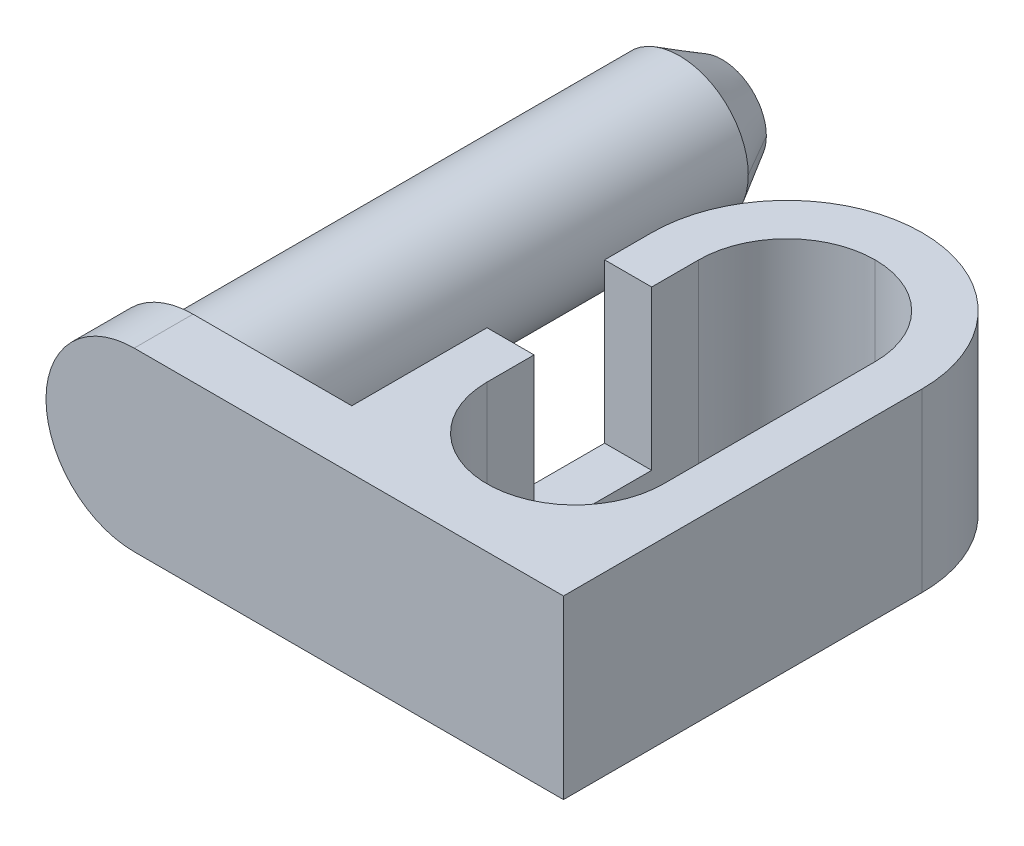
ISO-10303-21;
HEADER;
FILE_DESCRIPTION(('STEP AP214'),'2;1');
FILE_NAME('part.step','',(''),(''),'','','');
FILE_SCHEMA(('AUTOMOTIVE_DESIGN { 1 0 10303 214 1 1 1 1 }'));
ENDSEC;
DATA;
#1=APPLICATION_CONTEXT('core data for automotive mechanical design processes');
#2=APPLICATION_PROTOCOL_DEFINITION('international standard','automotive_design',2000,#1);
#3=PRODUCT_CONTEXT('',#1,'mechanical');
#4=PRODUCT('Part','Part','',(#3));
#5=PRODUCT_RELATED_PRODUCT_CATEGORY('part','',(#4));
#6=PRODUCT_DEFINITION_FORMATION('','',#4);
#7=PRODUCT_DEFINITION_CONTEXT('part definition',#1,'design');
#8=PRODUCT_DEFINITION('design','',#6,#7);
#9=PRODUCT_DEFINITION_SHAPE('','',#8);
#10=(LENGTH_UNIT() NAMED_UNIT(*) SI_UNIT(.MILLI.,.METRE.));
#11=(NAMED_UNIT(*) PLANE_ANGLE_UNIT() SI_UNIT($,.RADIAN.));
#12=(NAMED_UNIT(*) SI_UNIT($,.STERADIAN.) SOLID_ANGLE_UNIT());
#13=UNCERTAINTY_MEASURE_WITH_UNIT(LENGTH_MEASURE(1.E-05),#10,'distance_accuracy_value','');
#14=(GEOMETRIC_REPRESENTATION_CONTEXT(3) GLOBAL_UNCERTAINTY_ASSIGNED_CONTEXT((#13)) GLOBAL_UNIT_ASSIGNED_CONTEXT((#10,
#11,#12)) REPRESENTATION_CONTEXT('',''));
#15=CARTESIAN_POINT('',(0.,0.,0.));
#16=DIRECTION('',(0.,0.,1.));
#17=DIRECTION('',(1.,0.,0.));
#18=AXIS2_PLACEMENT_3D('',#15,#16,#17);
#19=CARTESIAN_POINT('',(0.,-12.,0.));
#20=DIRECTION('',(0.,1.,0.));
#21=DIRECTION('',(1.,0.,0.));
#22=AXIS2_PLACEMENT_3D('',#19,#20,#21);
#23=PLANE('',#22);
#24=DIRECTION('',(0.,0.,1.));
#25=VECTOR('',#24,1.);
#26=CARTESIAN_POINT('',(27.,-12.,75.));
#27=LINE('',#26,#25);
#28=CARTESIAN_POINT('',(27.,-12.,47.));
#29=VERTEX_POINT('',#28);
#30=CARTESIAN_POINT('',(27.,-12.,67.));
#31=VERTEX_POINT('',#30);
#32=EDGE_CURVE('E283',#29,#31,#27,.T.);
#33=ORIENTED_EDGE('',*,*,#32,.T.);
#34=DIRECTION('',(1.,0.,0.));
#35=VECTOR('',#34,1.);
#36=CARTESIAN_POINT('',(25.,-12.,67.));
#37=LINE('',#36,#35);
#38=CARTESIAN_POINT('',(35.,-12.,67.));
#39=VERTEX_POINT('',#38);
#40=EDGE_CURVE('E328',#31,#39,#37,.T.);
#41=ORIENTED_EDGE('',*,*,#40,.T.);
#42=DIRECTION('',(0.,0.,1.));
#43=VECTOR('',#42,1.);
#44=CARTESIAN_POINT('',(35.,-12.,75.));
#45=LINE('',#44,#43);
#46=CARTESIAN_POINT('',(35.,-12.,47.));
#47=VERTEX_POINT('',#46);
#48=EDGE_CURVE('E331',#47,#39,#45,.T.);
#49=ORIENTED_EDGE('',*,*,#48,.F.);
#50=DIRECTION('',(-1.,0.,0.));
#51=VECTOR('',#50,1.);
#52=CARTESIAN_POINT('',(25.,-12.,47.));
#53=LINE('',#52,#51);
#54=EDGE_CURVE('E53',#47,#29,#53,.T.);
#55=ORIENTED_EDGE('',*,*,#54,.T.);
#56=EDGE_LOOP('',(#33,#41,#49,#55));
#57=FACE_BOUND('',#56,.T.);
#58=ADVANCED_FACE('F45',(#57),#23,.T.);
#59=CARTESIAN_POINT('',(25.,-12.,47.));
#60=DIRECTION('',(0.,0.,-1.));
#61=DIRECTION('',(0.,-1.,0.));
#62=AXIS2_PLACEMENT_3D('',#59,#60,#61);
#63=PLANE('',#62);
#64=ORIENTED_EDGE('',*,*,#54,.F.);
#65=DIRECTION('',(0.,1.,0.));
#66=VECTOR('',#65,1.);
#67=CARTESIAN_POINT('',(35.,7.,47.));
#68=LINE('',#67,#66);
#69=CARTESIAN_POINT('',(35.,15.,47.));
#70=VERTEX_POINT('',#69);
#71=EDGE_CURVE('E364',#47,#70,#68,.T.);
#72=ORIENTED_EDGE('',*,*,#71,.T.);
#73=DIRECTION('',(-1.,0.,0.));
#74=VECTOR('',#73,1.);
#75=CARTESIAN_POINT('',(25.,15.,47.));
#76=LINE('',#75,#74);
#77=CARTESIAN_POINT('',(27.,15.,47.));
#78=VERTEX_POINT('',#77);
#79=EDGE_CURVE('E352',#70,#78,#76,.T.);
#80=ORIENTED_EDGE('',*,*,#79,.T.);
#81=DIRECTION('',(0.,1.,0.));
#82=VECTOR('',#81,1.);
#83=CARTESIAN_POINT('',(27.,7.,47.));
#84=LINE('',#83,#82);
#85=EDGE_CURVE('E465',#29,#78,#84,.T.);
#86=ORIENTED_EDGE('',*,*,#85,.F.);
#87=EDGE_LOOP('',(#64,#72,#80,#86));
#88=FACE_BOUND('',#87,.T.);
#89=ADVANCED_FACE('F516',(#88),#63,.F.);
#90=CARTESIAN_POINT('',(25.,-12.,67.));
#91=DIRECTION('',(0.,0.,1.));
#92=DIRECTION('',(1.,0.,0.));
#93=AXIS2_PLACEMENT_3D('',#90,#91,#92);
#94=PLANE('',#93);
#95=DIRECTION('',(1.,0.,0.));
#96=VECTOR('',#95,1.);
#97=CARTESIAN_POINT('',(25.,15.,67.));
#98=LINE('',#97,#96);
#99=CARTESIAN_POINT('',(27.,15.,67.));
#100=VERTEX_POINT('',#99);
#101=CARTESIAN_POINT('',(35.,15.,67.));
#102=VERTEX_POINT('',#101);
#103=EDGE_CURVE('E355',#100,#102,#98,.T.);
#104=ORIENTED_EDGE('',*,*,#103,.T.);
#105=DIRECTION('',(0.,-1.,0.));
#106=VECTOR('',#105,1.);
#107=CARTESIAN_POINT('',(35.,7.,67.));
#108=LINE('',#107,#106);
#109=EDGE_CURVE('E344',#102,#39,#108,.T.);
#110=ORIENTED_EDGE('',*,*,#109,.T.);
#111=ORIENTED_EDGE('',*,*,#40,.F.);
#112=DIRECTION('',(0.,-1.,0.));
#113=VECTOR('',#112,1.);
#114=CARTESIAN_POINT('',(27.,7.,67.));
#115=LINE('',#114,#113);
#116=EDGE_CURVE('E279',#100,#31,#115,.T.);
#117=ORIENTED_EDGE('',*,*,#116,.F.);
#118=EDGE_LOOP('',(#104,#110,#111,#117));
#119=FACE_BOUND('',#118,.T.);
#120=ADVANCED_FACE('F522',(#119),#94,.F.);
#121=CARTESIAN_POINT('',(35.,7.,75.));
#122=DIRECTION('',(1.,0.,0.));
#123=DIRECTION('',(0.,0.,-1.));
#124=AXIS2_PLACEMENT_3D('',#121,#122,#123);
#125=PLANE('',#124);
#126=ORIENTED_EDGE('',*,*,#109,.F.);
#127=DIRECTION('',(0.,0.,1.));
#128=VECTOR('',#127,1.);
#129=CARTESIAN_POINT('',(35.,15.,75.));
#130=LINE('',#129,#128);
#131=CARTESIAN_POINT('',(35.,15.,75.));
#132=VERTEX_POINT('',#131);
#133=EDGE_CURVE('E334',#102,#132,#130,.T.);
#134=ORIENTED_EDGE('',*,*,#133,.T.);
#135=DIRECTION('',(0.,-1.,0.));
#136=VECTOR('',#135,1.);
#137=CARTESIAN_POINT('',(35.,7.,75.));
#138=LINE('',#137,#136);
#139=CARTESIAN_POINT('',(35.,-15.,75.));
#140=VERTEX_POINT('',#139);
#141=EDGE_CURVE('E365',#132,#140,#138,.T.);
#142=ORIENTED_EDGE('',*,*,#141,.T.);
#143=DIRECTION('',(0.,0.,1.));
#144=VECTOR('',#143,1.);
#145=CARTESIAN_POINT('',(35.,-15.,75.));
#146=LINE('',#145,#144);
#147=CARTESIAN_POINT('',(35.,-15.,39.));
#148=VERTEX_POINT('',#147);
#149=EDGE_CURVE('E314',#148,#140,#146,.T.);
#150=ORIENTED_EDGE('',*,*,#149,.F.);
#151=DIRECTION('',(0.,-1.,0.));
#152=VECTOR('',#151,1.);
#153=CARTESIAN_POINT('',(35.,7.,39.));
#154=LINE('',#153,#152);
#155=CARTESIAN_POINT('',(35.,15.,39.));
#156=VERTEX_POINT('',#155);
#157=EDGE_CURVE('E341',#156,#148,#154,.T.);
#158=ORIENTED_EDGE('',*,*,#157,.F.);
#159=DIRECTION('',(0.,0.,1.));
#160=VECTOR('',#159,1.);
#161=CARTESIAN_POINT('',(35.,15.,75.));
#162=LINE('',#161,#160);
#163=EDGE_CURVE('E274',#156,#70,#162,.T.);
#164=ORIENTED_EDGE('',*,*,#163,.T.);
#165=ORIENTED_EDGE('',*,*,#71,.F.);
#166=ORIENTED_EDGE('',*,*,#48,.T.);
#167=EDGE_LOOP('',(#126,#134,#142,#150,#158,#164,#165,#166));
#168=FACE_BOUND('',#167,.T.);
#169=ADVANCED_FACE('F449',(#168),#125,.T.);
#170=CARTESIAN_POINT('',(50.,7.,39.));
#171=DIRECTION('',(0.,-1.,0.));
#172=DIRECTION('',(0.,0.,-1.));
#173=AXIS2_PLACEMENT_3D('',#170,#171,#172);
#174=CYLINDRICAL_SURFACE('',#173,15.);
#175=DIRECTION('',(0.,-1.,0.));
#176=VECTOR('',#175,1.);
#177=CARTESIAN_POINT('',(50.,7.,24.));
#178=LINE('',#177,#176);
#179=CARTESIAN_POINT('',(50.,15.,24.));
#180=VERTEX_POINT('',#179);
#181=CARTESIAN_POINT('',(50.,-15.,24.));
#182=VERTEX_POINT('',#181);
#183=EDGE_CURVE('E304',#180,#182,#178,.T.);
#184=ORIENTED_EDGE('',*,*,#183,.F.);
#185=CARTESIAN_POINT('',(50.,15.,39.));
#186=DIRECTION('',(0.,1.,0.));
#187=DIRECTION('',(0.,0.,1.));
#188=AXIS2_PLACEMENT_3D('',#185,#186,#187);
#189=CIRCLE('',#188,15.);
#190=EDGE_CURVE('E270',#180,#156,#189,.T.);
#191=ORIENTED_EDGE('',*,*,#190,.T.);
#192=ORIENTED_EDGE('',*,*,#157,.T.);
#193=CARTESIAN_POINT('',(50.,-15.,39.));
#194=DIRECTION('',(0.,1.,0.));
#195=DIRECTION('',(0.,0.,1.));
#196=AXIS2_PLACEMENT_3D('',#193,#194,#195);
#197=CIRCLE('',#196,15.);
#198=EDGE_CURVE('E288',#182,#148,#197,.T.);
#199=ORIENTED_EDGE('',*,*,#198,.F.);
#200=EDGE_LOOP('',(#184,#191,#192,#199));
#201=FACE_BOUND('',#200,.T.);
#202=ADVANCED_FACE('F446',(#201),#174,.F.);
#203=CARTESIAN_POINT('',(65.,7.,75.));
#204=DIRECTION('',(-1.,0.,0.));
#205=DIRECTION('',(0.,0.,1.));
#206=AXIS2_PLACEMENT_3D('',#203,#204,#205);
#207=PLANE('',#206);
#208=DIRECTION('',(0.,0.,-1.));
#209=VECTOR('',#208,1.);
#210=CARTESIAN_POINT('',(65.,-15.,75.));
#211=LINE('',#210,#209);
#212=CARTESIAN_POINT('',(65.,-15.,75.));
#213=VERTEX_POINT('',#212);
#214=CARTESIAN_POINT('',(65.,-15.,39.));
#215=VERTEX_POINT('',#214);
#216=EDGE_CURVE('E284',#213,#215,#211,.T.);
#217=ORIENTED_EDGE('',*,*,#216,.F.);
#218=DIRECTION('',(0.,-1.,0.));
#219=VECTOR('',#218,1.);
#220=CARTESIAN_POINT('',(65.,7.,75.));
#221=LINE('',#220,#219);
#222=CARTESIAN_POINT('',(65.,15.,75.));
#223=VERTEX_POINT('',#222);
#224=EDGE_CURVE('E345',#223,#213,#221,.T.);
#225=ORIENTED_EDGE('',*,*,#224,.F.);
#226=DIRECTION('',(0.,0.,-1.));
#227=VECTOR('',#226,1.);
#228=CARTESIAN_POINT('',(65.,15.,75.));
#229=LINE('',#228,#227);
#230=CARTESIAN_POINT('',(65.,15.,39.));
#231=VERTEX_POINT('',#230);
#232=EDGE_CURVE('E267',#223,#231,#229,.T.);
#233=ORIENTED_EDGE('',*,*,#232,.T.);
#234=DIRECTION('',(0.,-1.,0.));
#235=VECTOR('',#234,1.);
#236=CARTESIAN_POINT('',(65.,7.,39.));
#237=LINE('',#236,#235);
#238=EDGE_CURVE('E310',#231,#215,#237,.T.);
#239=ORIENTED_EDGE('',*,*,#238,.T.);
#240=EDGE_LOOP('',(#217,#225,#233,#239));
#241=FACE_BOUND('',#240,.T.);
#242=ADVANCED_FACE('F527',(#241),#207,.T.);
#243=CARTESIAN_POINT('',(50.,7.,75.));
#244=DIRECTION('',(0.,-1.,0.));
#245=DIRECTION('',(0.,0.,-1.));
#246=AXIS2_PLACEMENT_3D('',#243,#244,#245);
#247=CYLINDRICAL_SURFACE('',#246,15.);
#248=CARTESIAN_POINT('',(50.,-15.,75.));
#249=DIRECTION('',(0.,1.,0.));
#250=DIRECTION('',(0.,0.,1.));
#251=AXIS2_PLACEMENT_3D('',#248,#249,#250);
#252=CIRCLE('',#251,15.);
#253=EDGE_CURVE('E289',#140,#213,#252,.T.);
#254=ORIENTED_EDGE('',*,*,#253,.F.);
#255=ORIENTED_EDGE('',*,*,#141,.F.);
#256=CARTESIAN_POINT('',(50.,15.,75.));
#257=DIRECTION('',(0.,1.,0.));
#258=DIRECTION('',(0.,0.,1.));
#259=AXIS2_PLACEMENT_3D('',#256,#257,#258);
#260=CIRCLE('',#259,15.);
#261=EDGE_CURVE('E269',#132,#223,#260,.T.);
#262=ORIENTED_EDGE('',*,*,#261,.T.);
#263=ORIENTED_EDGE('',*,*,#224,.T.);
#264=EDGE_LOOP('',(#254,#255,#262,#263));
#265=FACE_BOUND('',#264,.T.);
#266=ADVANCED_FACE('F532',(#265),#247,.F.);
#267=CARTESIAN_POINT('',(50.,7.,39.));
#268=DIRECTION('',(0.,-1.,0.));
#269=DIRECTION('',(0.,0.,-1.));
#270=AXIS2_PLACEMENT_3D('',#267,#268,#269);
#271=CYLINDRICAL_SURFACE('',#270,23.);
#272=DIRECTION('',(0.,-1.,0.));
#273=VECTOR('',#272,1.);
#274=CARTESIAN_POINT('',(50.,7.,16.));
#275=LINE('',#274,#273);
#276=CARTESIAN_POINT('',(50.,15.,16.));
#277=VERTEX_POINT('',#276);
#278=CARTESIAN_POINT('',(50.,-15.,16.));
#279=VERTEX_POINT('',#278);
#280=EDGE_CURVE('E278',#277,#279,#275,.T.);
#281=ORIENTED_EDGE('',*,*,#280,.F.);
#282=CARTESIAN_POINT('',(50.,15.,39.));
#283=DIRECTION('',(0.,1.,0.));
#284=DIRECTION('',(0.,0.,1.));
#285=AXIS2_PLACEMENT_3D('',#282,#283,#284);
#286=CIRCLE('',#285,23.);
#287=CARTESIAN_POINT('',(73.,15.,39.));
#288=VERTEX_POINT('',#287);
#289=EDGE_CURVE('E294',#288,#277,#286,.T.);
#290=ORIENTED_EDGE('',*,*,#289,.F.);
#291=DIRECTION('',(0.,-1.,0.));
#292=VECTOR('',#291,1.);
#293=CARTESIAN_POINT('',(73.,7.,39.));
#294=LINE('',#293,#292);
#295=CARTESIAN_POINT('',(73.,-15.,39.));
#296=VERTEX_POINT('',#295);
#297=EDGE_CURVE('E265',#288,#296,#294,.T.);
#298=ORIENTED_EDGE('',*,*,#297,.T.);
#299=CARTESIAN_POINT('',(50.,-15.,39.));
#300=DIRECTION('',(0.,1.,0.));
#301=DIRECTION('',(0.,0.,1.));
#302=AXIS2_PLACEMENT_3D('',#299,#300,#301);
#303=CIRCLE('',#302,23.);
#304=EDGE_CURVE('E318',#296,#279,#303,.T.);
#305=ORIENTED_EDGE('',*,*,#304,.T.);
#306=EDGE_LOOP('',(#281,#290,#298,#305));
#307=FACE_BOUND('',#306,.T.);
#308=ADVANCED_FACE('F535',(#307),#271,.T.);
#309=CARTESIAN_POINT('',(73.,7.,75.));
#310=DIRECTION('',(-1.,0.,0.));
#311=DIRECTION('',(0.,0.,1.));
#312=AXIS2_PLACEMENT_3D('',#309,#310,#311);
#313=PLANE('',#312);
#314=DIRECTION('',(0.,0.,-1.));
#315=VECTOR('',#314,1.);
#316=CARTESIAN_POINT('',(73.,-15.,75.));
#317=LINE('',#316,#315);
#318=CARTESIAN_POINT('',(73.,-15.,100.));
#319=VERTEX_POINT('',#318);
#320=EDGE_CURVE('E235',#319,#296,#317,.T.);
#321=ORIENTED_EDGE('',*,*,#320,.T.);
#322=ORIENTED_EDGE('',*,*,#297,.F.);
#323=DIRECTION('',(0.,0.,-1.));
#324=VECTOR('',#323,1.);
#325=CARTESIAN_POINT('',(73.,15.,75.));
#326=LINE('',#325,#324);
#327=CARTESIAN_POINT('',(73.,15.,100.));
#328=VERTEX_POINT('',#327);
#329=EDGE_CURVE('E298',#328,#288,#326,.T.);
#330=ORIENTED_EDGE('',*,*,#329,.F.);
#331=DIRECTION('',(0.,1.,0.));
#332=VECTOR('',#331,1.);
#333=CARTESIAN_POINT('',(73.,15.,100.));
#334=LINE('',#333,#332);
#335=EDGE_CURVE('E183',#319,#328,#334,.T.);
#336=ORIENTED_EDGE('',*,*,#335,.F.);
#337=EDGE_LOOP('',(#321,#322,#330,#336));
#338=FACE_BOUND('',#337,.T.);
#339=ADVANCED_FACE('F531',(#338),#313,.F.);
#340=CARTESIAN_POINT('',(27.,7.,75.));
#341=DIRECTION('',(1.,0.,0.));
#342=DIRECTION('',(0.,0.,-1.));
#343=AXIS2_PLACEMENT_3D('',#340,#341,#342);
#344=PLANE('',#343);
#345=DIRECTION('',(0.,0.,1.));
#346=VECTOR('',#345,1.);
#347=CARTESIAN_POINT('',(27.,15.,75.));
#348=LINE('',#347,#346);
#349=CARTESIAN_POINT('',(27.,15.,90.));
#350=VERTEX_POINT('',#349);
#351=EDGE_CURVE('E338',#100,#350,#348,.T.);
#352=ORIENTED_EDGE('',*,*,#351,.F.);
#353=ORIENTED_EDGE('',*,*,#116,.T.);
#354=ORIENTED_EDGE('',*,*,#32,.F.);
#355=ORIENTED_EDGE('',*,*,#85,.T.);
#356=DIRECTION('',(0.,0.,1.));
#357=VECTOR('',#356,1.);
#358=CARTESIAN_POINT('',(27.,15.,75.));
#359=LINE('',#358,#357);
#360=CARTESIAN_POINT('',(27.,15.,39.));
#361=VERTEX_POINT('',#360);
#362=EDGE_CURVE('E297',#361,#78,#359,.T.);
#363=ORIENTED_EDGE('',*,*,#362,.F.);
#364=DIRECTION('',(0.,-1.,0.));
#365=VECTOR('',#364,1.);
#366=CARTESIAN_POINT('',(27.,7.,39.));
#367=LINE('',#366,#365);
#368=CARTESIAN_POINT('',(27.,-15.,39.));
#369=VERTEX_POINT('',#368);
#370=EDGE_CURVE('E253',#361,#369,#367,.T.);
#371=ORIENTED_EDGE('',*,*,#370,.T.);
#372=DIRECTION('',(0.,0.,1.));
#373=VECTOR('',#372,1.);
#374=CARTESIAN_POINT('',(27.,-15.,75.));
#375=LINE('',#374,#373);
#376=CARTESIAN_POINT('',(27.,-15.,90.));
#377=VERTEX_POINT('',#376);
#378=EDGE_CURVE('E371',#369,#377,#375,.T.);
#379=ORIENTED_EDGE('',*,*,#378,.T.);
#380=DIRECTION('',(0.,1.,0.));
#381=VECTOR('',#380,1.);
#382=CARTESIAN_POINT('',(27.,0.,90.));
#383=LINE('',#382,#381);
#384=EDGE_CURVE('E299',#377,#350,#383,.T.);
#385=ORIENTED_EDGE('',*,*,#384,.T.);
#386=EDGE_LOOP('',(#352,#353,#354,#355,#363,#371,#379,#385));
#387=FACE_BOUND('',#386,.T.);
#388=ADVANCED_FACE('F400',(#387),#344,.F.);
#389=CARTESIAN_POINT('',(0.,0.,100.));
#390=DIRECTION('',(0.,0.,1.));
#391=DIRECTION('',(1.,0.,0.));
#392=AXIS2_PLACEMENT_3D('',#389,#390,#391);
#393=PLANE('',#392);
#394=DIRECTION('',(-1.,0.,0.));
#395=VECTOR('',#394,1.);
#396=CARTESIAN_POINT('',(0.,15.,100.));
#397=LINE('',#396,#395);
#398=CARTESIAN_POINT('',(0.,15.,100.));
#399=VERTEX_POINT('',#398);
#400=EDGE_CURVE('E230',#328,#399,#397,.T.);
#401=ORIENTED_EDGE('',*,*,#400,.T.);
#402=CARTESIAN_POINT('',(0.,0.,100.));
#403=DIRECTION('',(0.,0.,1.));
#404=DIRECTION('',(1.,0.,0.));
#405=AXIS2_PLACEMENT_3D('',#402,#403,#404);
#406=CIRCLE('',#405,15.);
#407=CARTESIAN_POINT('',(-15.,0.,100.));
#408=VERTEX_POINT('',#407);
#409=EDGE_CURVE('E224',#399,#408,#406,.T.);
#410=ORIENTED_EDGE('',*,*,#409,.T.);
#411=CARTESIAN_POINT('',(0.,0.,100.));
#412=DIRECTION('',(0.,0.,1.));
#413=DIRECTION('',(1.,0.,0.));
#414=AXIS2_PLACEMENT_3D('',#411,#412,#413);
#415=CIRCLE('',#414,15.);
#416=CARTESIAN_POINT('',(0.,-15.,100.));
#417=VERTEX_POINT('',#416);
#418=EDGE_CURVE('E228',#408,#417,#415,.T.);
#419=ORIENTED_EDGE('',*,*,#418,.T.);
#420=DIRECTION('',(1.,0.,0.));
#421=VECTOR('',#420,1.);
#422=CARTESIAN_POINT('',(24.8906898338377,-15.,100.));
#423=LINE('',#422,#421);
#424=EDGE_CURVE('E368',#417,#319,#423,.T.);
#425=ORIENTED_EDGE('',*,*,#424,.T.);
#426=ORIENTED_EDGE('',*,*,#335,.T.);
#427=EDGE_LOOP('',(#401,#410,#419,#425,#426));
#428=FACE_BOUND('',#427,.T.);
#429=ADVANCED_FACE('F226',(#428),#393,.T.);
#430=CARTESIAN_POINT('',(24.8906898338377,-15.,100.));
#431=DIRECTION('',(0.,1.,0.));
#432=DIRECTION('',(1.,0.,0.));
#433=AXIS2_PLACEMENT_3D('',#430,#431,#432);
#434=PLANE('',#433);
#435=ORIENTED_EDGE('',*,*,#149,.T.);
#436=ORIENTED_EDGE('',*,*,#253,.T.);
#437=ORIENTED_EDGE('',*,*,#216,.T.);
#438=CARTESIAN_POINT('',(50.,-15.,39.));
#439=DIRECTION('',(0.,1.,0.));
#440=DIRECTION('',(0.,0.,1.));
#441=AXIS2_PLACEMENT_3D('',#438,#439,#440);
#442=CIRCLE('',#441,15.);
#443=EDGE_CURVE('E308',#215,#182,#442,.T.);
#444=ORIENTED_EDGE('',*,*,#443,.T.);
#445=ORIENTED_EDGE('',*,*,#198,.T.);
#446=EDGE_LOOP('',(#435,#436,#437,#444,#445));
#447=FACE_BOUND('',#446,.T.);
#448=ORIENTED_EDGE('',*,*,#320,.F.);
#449=ORIENTED_EDGE('',*,*,#424,.F.);
#450=DIRECTION('',(0.,0.,-1.));
#451=VECTOR('',#450,1.);
#452=CARTESIAN_POINT('',(0.,-15.,100.));
#453=LINE('',#452,#451);
#454=CARTESIAN_POINT('',(0.,-15.,90.));
#455=VERTEX_POINT('',#454);
#456=EDGE_CURVE('E251',#417,#455,#453,.T.);
#457=ORIENTED_EDGE('',*,*,#456,.T.);
#458=DIRECTION('',(1.,0.,0.));
#459=VECTOR('',#458,1.);
#460=CARTESIAN_POINT('',(24.8906898338377,-15.,90.));
#461=LINE('',#460,#459);
#462=EDGE_CURVE('E170',#455,#377,#461,.T.);
#463=ORIENTED_EDGE('',*,*,#462,.T.);
#464=ORIENTED_EDGE('',*,*,#378,.F.);
#465=CARTESIAN_POINT('',(50.,-15.,39.));
#466=DIRECTION('',(0.,1.,0.));
#467=DIRECTION('',(0.,0.,1.));
#468=AXIS2_PLACEMENT_3D('',#465,#466,#467);
#469=CIRCLE('',#468,23.);
#470=EDGE_CURVE('E261',#279,#369,#469,.T.);
#471=ORIENTED_EDGE('',*,*,#470,.F.);
#472=ORIENTED_EDGE('',*,*,#304,.F.);
#473=EDGE_LOOP('',(#448,#449,#457,#463,#464,#471,#472));
#474=FACE_BOUND('',#473,.T.);
#475=ADVANCED_FACE('F436',(#447,#474),#434,.F.);
#476=CARTESIAN_POINT('',(0.,0.,100.));
#477=DIRECTION('',(0.,0.,-1.));
#478=DIRECTION('',(-1.,0.,0.));
#479=AXIS2_PLACEMENT_3D('',#476,#477,#478);
#480=CYLINDRICAL_SURFACE('',#479,15.);
#481=DIRECTION('',(0.,0.,-1.));
#482=VECTOR('',#481,1.);
#483=CARTESIAN_POINT('',(-15.,0.,100.));
#484=LINE('',#483,#482);
#485=CARTESIAN_POINT('',(-15.,0.,90.));
#486=VERTEX_POINT('',#485);
#487=EDGE_CURVE('E239',#408,#486,#484,.T.);
#488=ORIENTED_EDGE('',*,*,#487,.F.);
#489=ORIENTED_EDGE('',*,*,#409,.F.);
#490=DIRECTION('',(0.,0.,-1.));
#491=VECTOR('',#490,1.);
#492=CARTESIAN_POINT('',(0.,15.,100.));
#493=LINE('',#492,#491);
#494=CARTESIAN_POINT('',(0.,15.,90.));
#495=VERTEX_POINT('',#494);
#496=EDGE_CURVE('E322',#399,#495,#493,.T.);
#497=ORIENTED_EDGE('',*,*,#496,.T.);
#498=CARTESIAN_POINT('',(0.,0.,90.));
#499=DIRECTION('',(0.,0.,1.));
#500=DIRECTION('',(1.,0.,0.));
#501=AXIS2_PLACEMENT_3D('',#498,#499,#500);
#502=CIRCLE('',#501,15.);
#503=EDGE_CURVE('E242',#495,#486,#502,.T.);
#504=ORIENTED_EDGE('',*,*,#503,.T.);
#505=EDGE_LOOP('',(#488,#489,#497,#504));
#506=FACE_BOUND('',#505,.T.);
#507=ADVANCED_FACE('F240',(#506),#480,.T.);
#508=CARTESIAN_POINT('',(0.,0.,90.));
#509=DIRECTION('',(0.,0.,1.));
#510=DIRECTION('',(1.,0.,0.));
#511=AXIS2_PLACEMENT_3D('',#508,#509,#510);
#512=PLANE('',#511);
#513=ORIENTED_EDGE('',*,*,#384,.F.);
#514=ORIENTED_EDGE('',*,*,#462,.F.);
#515=CARTESIAN_POINT('',(0.,0.,90.));
#516=DIRECTION('',(0.,0.,1.));
#517=DIRECTION('',(1.,0.,0.));
#518=AXIS2_PLACEMENT_3D('',#515,#516,#517);
#519=CIRCLE('',#518,15.);
#520=EDGE_CURVE('E247',#486,#455,#519,.T.);
#521=ORIENTED_EDGE('',*,*,#520,.F.);
#522=ORIENTED_EDGE('',*,*,#503,.F.);
#523=DIRECTION('',(-1.,0.,0.));
#524=VECTOR('',#523,1.);
#525=CARTESIAN_POINT('',(0.,15.,90.));
#526=LINE('',#525,#524);
#527=EDGE_CURVE('E325',#350,#495,#526,.T.);
#528=ORIENTED_EDGE('',*,*,#527,.F.);
#529=EDGE_LOOP('',(#513,#514,#521,#522,#528));
#530=FACE_BOUND('',#529,.T.);
#531=CARTESIAN_POINT('',(0.,0.,90.));
#532=DIRECTION('',(0.,0.,-1.));
#533=DIRECTION('',(-1.,0.,0.));
#534=AXIS2_PLACEMENT_3D('',#531,#532,#533);
#535=CIRCLE('',#534,11.7016953197734);
#536=CARTESIAN_POINT('',(-11.7016953197734,0.,90.));
#537=VERTEX_POINT('',#536);
#538=EDGE_CURVE('E500',#537,#537,#535,.T.);
#539=ORIENTED_EDGE('',*,*,#538,.F.);
#540=EDGE_LOOP('',(#539));
#541=FACE_BOUND('',#540,.T.);
#542=ADVANCED_FACE('F404',(#530,#541),#512,.F.);
#543=CARTESIAN_POINT('',(0.,15.,100.));
#544=DIRECTION('',(0.,-1.,0.));
#545=DIRECTION('',(0.,0.,-1.));
#546=AXIS2_PLACEMENT_3D('',#543,#544,#545);
#547=PLANE('',#546);
#548=ORIENTED_EDGE('',*,*,#133,.F.);
#549=ORIENTED_EDGE('',*,*,#103,.F.);
#550=ORIENTED_EDGE('',*,*,#351,.T.);
#551=ORIENTED_EDGE('',*,*,#527,.T.);
#552=ORIENTED_EDGE('',*,*,#496,.F.);
#553=ORIENTED_EDGE('',*,*,#400,.F.);
#554=ORIENTED_EDGE('',*,*,#329,.T.);
#555=ORIENTED_EDGE('',*,*,#289,.T.);
#556=CARTESIAN_POINT('',(50.,15.,39.));
#557=DIRECTION('',(0.,1.,0.));
#558=DIRECTION('',(0.,0.,1.));
#559=AXIS2_PLACEMENT_3D('',#556,#557,#558);
#560=CIRCLE('',#559,23.);
#561=EDGE_CURVE('E293',#277,#361,#560,.T.);
#562=ORIENTED_EDGE('',*,*,#561,.T.);
#563=ORIENTED_EDGE('',*,*,#362,.T.);
#564=ORIENTED_EDGE('',*,*,#79,.F.);
#565=ORIENTED_EDGE('',*,*,#163,.F.);
#566=ORIENTED_EDGE('',*,*,#190,.F.);
#567=CARTESIAN_POINT('',(50.,15.,39.));
#568=DIRECTION('',(0.,1.,0.));
#569=DIRECTION('',(0.,0.,1.));
#570=AXIS2_PLACEMENT_3D('',#567,#568,#569);
#571=CIRCLE('',#570,15.);
#572=EDGE_CURVE('E309',#231,#180,#571,.T.);
#573=ORIENTED_EDGE('',*,*,#572,.F.);
#574=ORIENTED_EDGE('',*,*,#232,.F.);
#575=ORIENTED_EDGE('',*,*,#261,.F.);
#576=EDGE_LOOP('',(#548,#549,#550,#551,#552,#553,#554,#555,#562,#563,#564,#565,#566,#573,#574,#575));
#577=FACE_BOUND('',#576,.T.);
#578=ADVANCED_FACE('F397',(#577),#547,.F.);
#579=CARTESIAN_POINT('',(0.,0.,100.));
#580=DIRECTION('',(0.,0.,-1.));
#581=DIRECTION('',(-1.,0.,0.));
#582=AXIS2_PLACEMENT_3D('',#579,#580,#581);
#583=CYLINDRICAL_SURFACE('',#582,15.);
#584=ORIENTED_EDGE('',*,*,#418,.F.);
#585=ORIENTED_EDGE('',*,*,#487,.T.);
#586=ORIENTED_EDGE('',*,*,#520,.T.);
#587=ORIENTED_EDGE('',*,*,#456,.F.);
#588=EDGE_LOOP('',(#584,#585,#586,#587));
#589=FACE_BOUND('',#588,.T.);
#590=ADVANCED_FACE('F250',(#589),#583,.T.);
#591=CARTESIAN_POINT('',(50.,7.,39.));
#592=DIRECTION('',(0.,-1.,0.));
#593=DIRECTION('',(0.,0.,-1.));
#594=AXIS2_PLACEMENT_3D('',#591,#592,#593);
#595=CYLINDRICAL_SURFACE('',#594,23.);
#596=ORIENTED_EDGE('',*,*,#561,.F.);
#597=ORIENTED_EDGE('',*,*,#280,.T.);
#598=ORIENTED_EDGE('',*,*,#470,.T.);
#599=ORIENTED_EDGE('',*,*,#370,.F.);
#600=EDGE_LOOP('',(#596,#597,#598,#599));
#601=FACE_BOUND('',#600,.T.);
#602=ADVANCED_FACE('F536',(#601),#595,.T.);
#603=CARTESIAN_POINT('',(50.,7.,39.));
#604=DIRECTION('',(0.,-1.,0.));
#605=DIRECTION('',(0.,0.,-1.));
#606=AXIS2_PLACEMENT_3D('',#603,#604,#605);
#607=CYLINDRICAL_SURFACE('',#606,15.);
#608=ORIENTED_EDGE('',*,*,#572,.T.);
#609=ORIENTED_EDGE('',*,*,#183,.T.);
#610=ORIENTED_EDGE('',*,*,#443,.F.);
#611=ORIENTED_EDGE('',*,*,#238,.F.);
#612=EDGE_LOOP('',(#608,#609,#610,#611));
#613=FACE_BOUND('',#612,.T.);
#614=ADVANCED_FACE('F47',(#613),#607,.F.);
#615=CARTESIAN_POINT('',(0.,0.,90.));
#616=DIRECTION('',(0.,0.,-1.));
#617=DIRECTION('',(-1.,0.,0.));
#618=AXIS2_PLACEMENT_3D('',#615,#616,#617);
#619=CYLINDRICAL_SURFACE('',#618,11.7016953197734);
#620=CARTESIAN_POINT('',(0.,0.,7.27754977177203));
#621=DIRECTION('',(0.,0.,1.));
#622=DIRECTION('',(1.,0.,0.));
#623=AXIS2_PLACEMENT_3D('',#620,#621,#622);
#624=CIRCLE('',#623,11.7016953197734);
#625=CARTESIAN_POINT('',(-11.7016953197734,0.,7.27754977177203));
#626=VERTEX_POINT('',#625);
#627=CARTESIAN_POINT('',(11.7016953197734,0.,7.27754977177203));
#628=VERTEX_POINT('',#627);
#629=EDGE_CURVE('E12',#626,#628,#624,.F.);
#630=ORIENTED_EDGE('',*,*,#629,.F.);
#631=CARTESIAN_POINT('',(0.,0.,7.27754977177203));
#632=DIRECTION('',(0.,0.,1.));
#633=DIRECTION('',(1.,0.,0.));
#634=AXIS2_PLACEMENT_3D('',#631,#632,#633);
#635=CIRCLE('',#634,11.7016953197734);
#636=EDGE_CURVE('E59',#628,#626,#635,.F.);
#637=ORIENTED_EDGE('',*,*,#636,.F.);
#638=EDGE_LOOP('',(#630,#637));
#639=FACE_BOUND('',#638,.T.);
#640=ORIENTED_EDGE('',*,*,#538,.T.);
#641=EDGE_LOOP('',(#640));
#642=FACE_BOUND('',#641,.T.);
#643=ADVANCED_FACE('F504',(#639,#642),#619,.T.);
#644=CARTESIAN_POINT('',(0.,0.,0.));
#645=DIRECTION('',(0.,0.,1.));
#646=DIRECTION('',(1.,0.,0.));
#647=AXIS2_PLACEMENT_3D('',#644,#645,#646);
#648=PLANE('',#647);
#649=CARTESIAN_POINT('',(0.,0.,0.));
#650=DIRECTION('',(0.,0.,-1.));
#651=DIRECTION('',(1.,0.,0.));
#652=AXIS2_PLACEMENT_3D('',#649,#650,#651);
#653=CIRCLE('',#652,7.49999999999988);
#654=CARTESIAN_POINT('',(7.49999999999988,0.,0.));
#655=VERTEX_POINT('',#654);
#656=CARTESIAN_POINT('',(-7.49999999999988,0.,0.));
#657=VERTEX_POINT('',#656);
#658=EDGE_CURVE('E236',#655,#657,#653,.T.);
#659=ORIENTED_EDGE('',*,*,#658,.T.);
#660=CARTESIAN_POINT('',(0.,0.,0.));
#661=DIRECTION('',(0.,0.,-1.));
#662=DIRECTION('',(1.,0.,0.));
#663=AXIS2_PLACEMENT_3D('',#660,#661,#662);
#664=CIRCLE('',#663,7.49999999999988);
#665=EDGE_CURVE('E386',#657,#655,#664,.T.);
#666=ORIENTED_EDGE('',*,*,#665,.T.);
#667=EDGE_LOOP('',(#659,#666));
#668=FACE_BOUND('',#667,.T.);
#669=ADVANCED_FACE('F548',(#668),#648,.F.);
#670=CARTESIAN_POINT('',(0.,0.,8.66025403784457));
#671=DIRECTION('',(0.,0.,1.));
#672=DIRECTION('',(1.,0.,0.));
#673=AXIS2_PLACEMENT_3D('',#670,#671,#672);
#674=CONICAL_SURFACE('',#673,12.5,0.523598775598299);
#675=DIRECTION('',(-0.5,0.,0.866025403784438));
#676=VECTOR('',#675,1.);
#677=CARTESIAN_POINT('',(-12.5,0.,8.66025403784457));
#678=LINE('',#677,#676);
#679=EDGE_CURVE('E381',#657,#626,#678,.T.);
#680=ORIENTED_EDGE('',*,*,#679,.T.);
#681=ORIENTED_EDGE('',*,*,#629,.T.);
#682=DIRECTION('',(0.5,0.,0.866025403784438));
#683=VECTOR('',#682,1.);
#684=CARTESIAN_POINT('',(12.5,0.,8.66025403784457));
#685=LINE('',#684,#683);
#686=EDGE_CURVE('E385',#655,#628,#685,.T.);
#687=ORIENTED_EDGE('',*,*,#686,.F.);
#688=ORIENTED_EDGE('',*,*,#665,.F.);
#689=EDGE_LOOP('',(#680,#681,#687,#688));
#690=FACE_BOUND('',#689,.T.);
#691=ADVANCED_FACE('F545',(#690),#674,.T.);
#692=CARTESIAN_POINT('',(0.,0.,8.66025403784457));
#693=DIRECTION('',(0.,0.,1.));
#694=DIRECTION('',(1.,0.,0.));
#695=AXIS2_PLACEMENT_3D('',#692,#693,#694);
#696=CONICAL_SURFACE('',#695,12.5,0.523598775598299);
#697=ORIENTED_EDGE('',*,*,#686,.T.);
#698=ORIENTED_EDGE('',*,*,#636,.T.);
#699=ORIENTED_EDGE('',*,*,#679,.F.);
#700=ORIENTED_EDGE('',*,*,#658,.F.);
#701=EDGE_LOOP('',(#697,#698,#699,#700));
#702=FACE_BOUND('',#701,.T.);
#703=ADVANCED_FACE('F547',(#702),#696,.T.);
#704=CLOSED_SHELL('',(#58,#89,#120,#169,#202,#242,#266,#308,#339,#388,#429,#475,#507,#542,#578,
#590,#602,#614,#643,#669,#691,#703));
#705=MANIFOLD_SOLID_BREP('B2',#704);
#706=ADVANCED_BREP_SHAPE_REPRESENTATION('',(#18,#705),#14);
#707=SHAPE_DEFINITION_REPRESENTATION(#9,#706);
ENDSEC;
END-ISO-10303-21;
